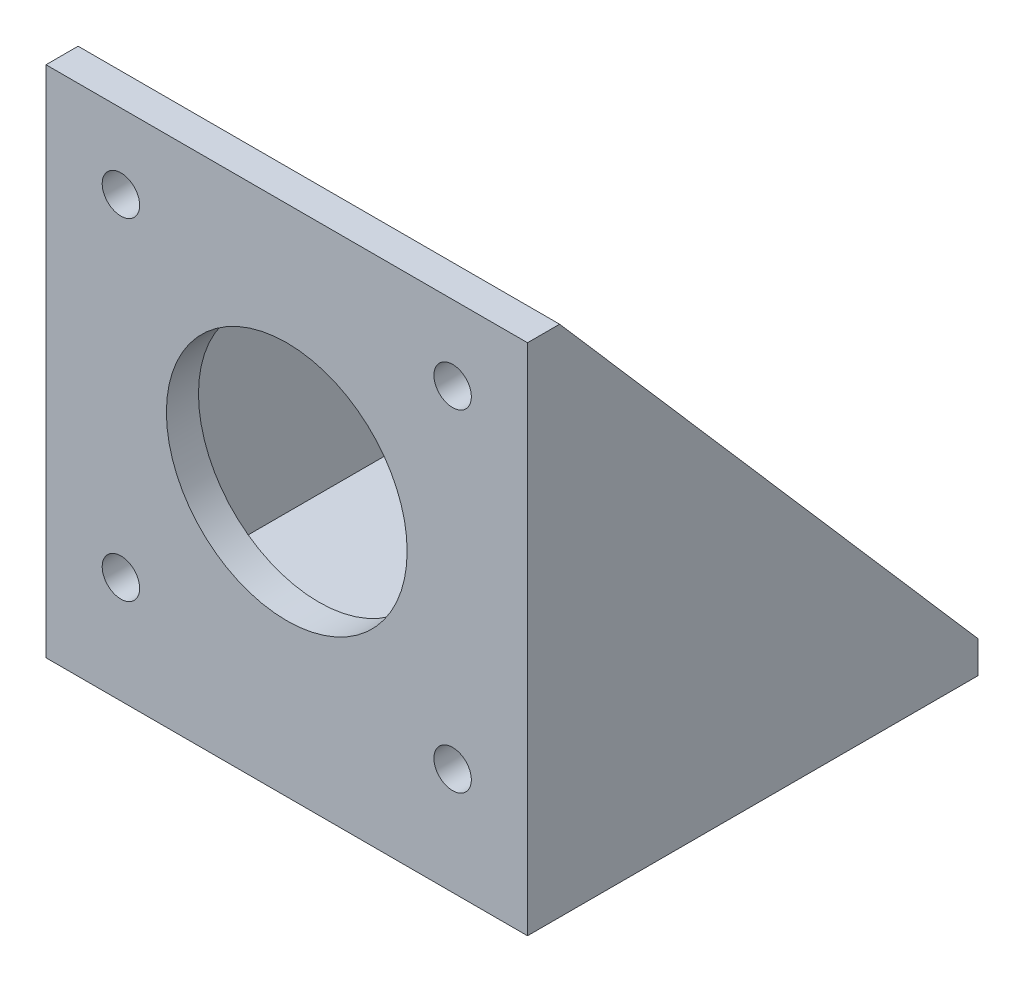
ISO-10303-21;
HEADER;
FILE_DESCRIPTION(('STEP AP214'),'2;1');
FILE_NAME('part.step','',(''),(''),'','','');
FILE_SCHEMA(('AUTOMOTIVE_DESIGN { 1 0 10303 214 1 1 1 1 }'));
ENDSEC;
DATA;
#1=APPLICATION_CONTEXT('core data for automotive mechanical design processes');
#2=APPLICATION_PROTOCOL_DEFINITION('international standard','automotive_design',2000,#1);
#3=PRODUCT_CONTEXT('',#1,'mechanical');
#4=PRODUCT('Part','Part','',(#3));
#5=PRODUCT_RELATED_PRODUCT_CATEGORY('part','',(#4));
#6=PRODUCT_DEFINITION_FORMATION('','',#4);
#7=PRODUCT_DEFINITION_CONTEXT('part definition',#1,'design');
#8=PRODUCT_DEFINITION('design','',#6,#7);
#9=PRODUCT_DEFINITION_SHAPE('','',#8);
#10=(LENGTH_UNIT() NAMED_UNIT(*) SI_UNIT(.MILLI.,.METRE.));
#11=(NAMED_UNIT(*) PLANE_ANGLE_UNIT() SI_UNIT($,.RADIAN.));
#12=(NAMED_UNIT(*) SI_UNIT($,.STERADIAN.) SOLID_ANGLE_UNIT());
#13=UNCERTAINTY_MEASURE_WITH_UNIT(LENGTH_MEASURE(1.E-05),#10,'distance_accuracy_value','');
#14=(GEOMETRIC_REPRESENTATION_CONTEXT(3) GLOBAL_UNCERTAINTY_ASSIGNED_CONTEXT((#13)) GLOBAL_UNIT_ASSIGNED_CONTEXT((#10,
#11,#12)) REPRESENTATION_CONTEXT('',''));
#15=CARTESIAN_POINT('',(0.,0.,0.));
#16=DIRECTION('',(0.,0.,1.));
#17=DIRECTION('',(1.,0.,0.));
#18=AXIS2_PLACEMENT_3D('',#15,#16,#17);
#19=CARTESIAN_POINT('',(0.,3.,0.));
#20=DIRECTION('',(0.,-1.,0.));
#21=DIRECTION('',(0.,0.,-1.));
#22=AXIS2_PLACEMENT_3D('',#19,#20,#21);
#23=PLANE('',#22);
#24=CARTESIAN_POINT('',(12.5,3.,-10.));
#25=DIRECTION('',(0.,1.,0.));
#26=DIRECTION('',(0.,0.,1.));
#27=AXIS2_PLACEMENT_3D('',#24,#25,#26);
#28=CIRCLE('',#27,1.55);
#29=CARTESIAN_POINT('',(12.5,3.,-8.45));
#30=VERTEX_POINT('',#29);
#31=EDGE_CURVE('E227',#30,#30,#28,.T.);
#32=ORIENTED_EDGE('',*,*,#31,.F.);
#33=EDGE_LOOP('',(#32));
#34=FACE_BOUND('',#33,.T.);
#35=CARTESIAN_POINT('',(-12.5,3.,-10.));
#36=DIRECTION('',(0.,1.,0.));
#37=DIRECTION('',(0.,0.,1.));
#38=AXIS2_PLACEMENT_3D('',#35,#36,#37);
#39=CIRCLE('',#38,1.55);
#40=CARTESIAN_POINT('',(-12.5,3.,-8.45));
#41=VERTEX_POINT('',#40);
#42=EDGE_CURVE('E221',#41,#41,#39,.T.);
#43=ORIENTED_EDGE('',*,*,#42,.F.);
#44=EDGE_LOOP('',(#43));
#45=FACE_BOUND('',#44,.T.);
#46=CARTESIAN_POINT('',(-12.5,3.,10.));
#47=DIRECTION('',(0.,1.,0.));
#48=DIRECTION('',(0.,0.,1.));
#49=AXIS2_PLACEMENT_3D('',#46,#47,#48);
#50=CIRCLE('',#49,1.55);
#51=CARTESIAN_POINT('',(-12.5,3.,11.55));
#52=VERTEX_POINT('',#51);
#53=EDGE_CURVE('E215',#52,#52,#50,.T.);
#54=ORIENTED_EDGE('',*,*,#53,.F.);
#55=EDGE_LOOP('',(#54));
#56=FACE_BOUND('',#55,.T.);
#57=CARTESIAN_POINT('',(12.5,3.,10.));
#58=DIRECTION('',(0.,1.,0.));
#59=DIRECTION('',(0.,0.,1.));
#60=AXIS2_PLACEMENT_3D('',#57,#58,#59);
#61=CIRCLE('',#60,1.55);
#62=CARTESIAN_POINT('',(12.5,3.,11.55));
#63=VERTEX_POINT('',#62);
#64=EDGE_CURVE('E209',#63,#63,#61,.T.);
#65=ORIENTED_EDGE('',*,*,#64,.F.);
#66=EDGE_LOOP('',(#65));
#67=FACE_BOUND('',#66,.T.);
#68=DIRECTION('',(0.,0.,-1.));
#69=VECTOR('',#68,1.);
#70=CARTESIAN_POINT('',(-20.,3.,-21.05));
#71=LINE('',#70,#69);
#72=CARTESIAN_POINT('',(-20.,3.,18.05));
#73=VERTEX_POINT('',#72);
#74=CARTESIAN_POINT('',(-20.,3.,-21.05));
#75=VERTEX_POINT('',#74);
#76=EDGE_CURVE('E52',#73,#75,#71,.T.);
#77=ORIENTED_EDGE('',*,*,#76,.F.);
#78=DIRECTION('',(1.,0.,0.));
#79=VECTOR('',#78,1.);
#80=CARTESIAN_POINT('',(-22.5,3.,18.05));
#81=LINE('',#80,#79);
#82=CARTESIAN_POINT('',(20.,3.,18.05));
#83=VERTEX_POINT('',#82);
#84=EDGE_CURVE('E39',#73,#83,#81,.T.);
#85=ORIENTED_EDGE('',*,*,#84,.T.);
#86=DIRECTION('',(0.,0.,-1.));
#87=VECTOR('',#86,1.);
#88=CARTESIAN_POINT('',(20.,3.,-21.05));
#89=LINE('',#88,#87);
#90=CARTESIAN_POINT('',(20.,3.,-21.05));
#91=VERTEX_POINT('',#90);
#92=EDGE_CURVE('E238',#83,#91,#89,.T.);
#93=ORIENTED_EDGE('',*,*,#92,.T.);
#94=DIRECTION('',(-1.,0.,0.));
#95=VECTOR('',#94,1.);
#96=CARTESIAN_POINT('',(-22.5,3.,-21.05));
#97=LINE('',#96,#95);
#98=EDGE_CURVE('E146',#91,#75,#97,.T.);
#99=ORIENTED_EDGE('',*,*,#98,.T.);
#100=EDGE_LOOP('',(#77,#85,#93,#99));
#101=FACE_BOUND('',#100,.T.);
#102=ADVANCED_FACE('F35',(#34,#45,#56,#67,#101),#23,.F.);
#103=CARTESIAN_POINT('',(-22.5,48.,18.05));
#104=DIRECTION('',(0.,0.,-1.));
#105=DIRECTION('',(-1.,0.,0.));
#106=AXIS2_PLACEMENT_3D('',#103,#104,#105);
#107=PLANE('',#106);
#108=CARTESIAN_POINT('',(15.5,10.,18.05));
#109=DIRECTION('',(0.,0.,-1.));
#110=DIRECTION('',(-1.,0.,0.));
#111=AXIS2_PLACEMENT_3D('',#108,#109,#110);
#112=CIRCLE('',#111,1.75);
#113=CARTESIAN_POINT('',(13.75,10.,18.05));
#114=VERTEX_POINT('',#113);
#115=EDGE_CURVE('E203',#114,#114,#112,.T.);
#116=ORIENTED_EDGE('',*,*,#115,.F.);
#117=EDGE_LOOP('',(#116));
#118=FACE_BOUND('',#117,.T.);
#119=CARTESIAN_POINT('',(-15.5,10.,18.05));
#120=DIRECTION('',(0.,0.,-1.));
#121=DIRECTION('',(-1.,0.,0.));
#122=AXIS2_PLACEMENT_3D('',#119,#120,#121);
#123=CIRCLE('',#122,1.75);
#124=CARTESIAN_POINT('',(-17.25,10.,18.05));
#125=VERTEX_POINT('',#124);
#126=EDGE_CURVE('E197',#125,#125,#123,.T.);
#127=ORIENTED_EDGE('',*,*,#126,.F.);
#128=EDGE_LOOP('',(#127));
#129=FACE_BOUND('',#128,.T.);
#130=CARTESIAN_POINT('',(-15.5,41.,18.05));
#131=DIRECTION('',(0.,0.,-1.));
#132=DIRECTION('',(-1.,0.,0.));
#133=AXIS2_PLACEMENT_3D('',#130,#131,#132);
#134=CIRCLE('',#133,1.75);
#135=CARTESIAN_POINT('',(-17.25,41.,18.05));
#136=VERTEX_POINT('',#135);
#137=EDGE_CURVE('E191',#136,#136,#134,.T.);
#138=ORIENTED_EDGE('',*,*,#137,.F.);
#139=EDGE_LOOP('',(#138));
#140=FACE_BOUND('',#139,.T.);
#141=CARTESIAN_POINT('',(15.5,41.,18.05));
#142=DIRECTION('',(0.,0.,-1.));
#143=DIRECTION('',(-1.,0.,0.));
#144=AXIS2_PLACEMENT_3D('',#141,#142,#143);
#145=CIRCLE('',#144,1.75);
#146=CARTESIAN_POINT('',(13.75,41.,18.05));
#147=VERTEX_POINT('',#146);
#148=EDGE_CURVE('E185',#147,#147,#145,.T.);
#149=ORIENTED_EDGE('',*,*,#148,.F.);
#150=EDGE_LOOP('',(#149));
#151=FACE_BOUND('',#150,.T.);
#152=CARTESIAN_POINT('',(0.,25.5,18.05));
#153=DIRECTION('',(0.,0.,-1.));
#154=DIRECTION('',(-1.,0.,0.));
#155=AXIS2_PLACEMENT_3D('',#152,#153,#154);
#156=CIRCLE('',#155,11.25);
#157=CARTESIAN_POINT('',(-11.25,25.5,18.05));
#158=VERTEX_POINT('',#157);
#159=EDGE_CURVE('E178',#158,#158,#156,.T.);
#160=ORIENTED_EDGE('',*,*,#159,.F.);
#161=EDGE_LOOP('',(#160));
#162=FACE_BOUND('',#161,.T.);
#163=ORIENTED_EDGE('',*,*,#84,.F.);
#164=DIRECTION('',(0.,-1.,0.));
#165=VECTOR('',#164,1.);
#166=CARTESIAN_POINT('',(-20.,3.,18.05));
#167=LINE('',#166,#165);
#168=CARTESIAN_POINT('',(-20.,48.,18.05));
#169=VERTEX_POINT('',#168);
#170=EDGE_CURVE('E117',#169,#73,#167,.T.);
#171=ORIENTED_EDGE('',*,*,#170,.F.);
#172=DIRECTION('',(1.,0.,0.));
#173=VECTOR('',#172,1.);
#174=CARTESIAN_POINT('',(-22.5,48.,18.05));
#175=LINE('',#174,#173);
#176=CARTESIAN_POINT('',(20.,48.,18.05));
#177=VERTEX_POINT('',#176);
#178=EDGE_CURVE('E102',#169,#177,#175,.T.);
#179=ORIENTED_EDGE('',*,*,#178,.T.);
#180=DIRECTION('',(0.,-1.,0.));
#181=VECTOR('',#180,1.);
#182=CARTESIAN_POINT('',(20.,3.,18.05));
#183=LINE('',#182,#181);
#184=EDGE_CURVE('E235',#177,#83,#183,.T.);
#185=ORIENTED_EDGE('',*,*,#184,.T.);
#186=EDGE_LOOP('',(#163,#171,#179,#185));
#187=FACE_BOUND('',#186,.T.);
#188=ADVANCED_FACE('F119',(#118,#129,#140,#151,#162,#187),#107,.T.);
#189=CARTESIAN_POINT('',(22.5,3.,21.05));
#190=DIRECTION('',(-1.,0.,0.));
#191=DIRECTION('',(0.,0.,1.));
#192=AXIS2_PLACEMENT_3D('',#189,#190,#191);
#193=PLANE('',#192);
#194=DIRECTION('',(0.,-1.,0.));
#195=VECTOR('',#194,1.);
#196=CARTESIAN_POINT('',(22.5,3.,-21.05));
#197=LINE('',#196,#195);
#198=CARTESIAN_POINT('',(22.5,3.,-21.05));
#199=VERTEX_POINT('',#198);
#200=CARTESIAN_POINT('',(22.5,0.,-21.05));
#201=VERTEX_POINT('',#200);
#202=EDGE_CURVE('E11',#199,#201,#197,.T.);
#203=ORIENTED_EDGE('',*,*,#202,.F.);
#204=DIRECTION('',(0.,0.75485825926705,0.655887954163148));
#205=VECTOR('',#204,1.);
#206=CARTESIAN_POINT('',(22.5,48.,18.05));
#207=LINE('',#206,#205);
#208=CARTESIAN_POINT('',(22.5,48.,18.05));
#209=VERTEX_POINT('',#208);
#210=EDGE_CURVE('E175',#199,#209,#207,.T.);
#211=ORIENTED_EDGE('',*,*,#210,.T.);
#212=DIRECTION('',(0.,0.,1.));
#213=VECTOR('',#212,1.);
#214=CARTESIAN_POINT('',(22.5,48.,21.05));
#215=LINE('',#214,#213);
#216=CARTESIAN_POINT('',(22.5,48.,21.05));
#217=VERTEX_POINT('',#216);
#218=EDGE_CURVE('E131',#209,#217,#215,.T.);
#219=ORIENTED_EDGE('',*,*,#218,.T.);
#220=DIRECTION('',(0.,-1.,0.));
#221=VECTOR('',#220,1.);
#222=CARTESIAN_POINT('',(22.5,3.,21.05));
#223=LINE('',#222,#221);
#224=CARTESIAN_POINT('',(22.5,0.,21.05));
#225=VERTEX_POINT('',#224);
#226=EDGE_CURVE('E145',#217,#225,#223,.T.);
#227=ORIENTED_EDGE('',*,*,#226,.T.);
#228=DIRECTION('',(0.,0.,-1.));
#229=VECTOR('',#228,1.);
#230=CARTESIAN_POINT('',(22.5,0.,21.05));
#231=LINE('',#230,#229);
#232=EDGE_CURVE('E139',#225,#201,#231,.T.);
#233=ORIENTED_EDGE('',*,*,#232,.T.);
#234=EDGE_LOOP('',(#203,#211,#219,#227,#233));
#235=FACE_BOUND('',#234,.T.);
#236=ADVANCED_FACE('F37',(#235),#193,.F.);
#237=CARTESIAN_POINT('',(-22.5,3.,-21.05));
#238=DIRECTION('',(0.,0.,1.));
#239=DIRECTION('',(1.,0.,0.));
#240=AXIS2_PLACEMENT_3D('',#237,#238,#239);
#241=PLANE('',#240);
#242=DIRECTION('',(-1.,0.,0.));
#243=VECTOR('',#242,1.);
#244=CARTESIAN_POINT('',(-22.5,0.,-21.05));
#245=LINE('',#244,#243);
#246=CARTESIAN_POINT('',(-22.5,0.,-21.05));
#247=VERTEX_POINT('',#246);
#248=EDGE_CURVE('E149',#201,#247,#245,.T.);
#249=ORIENTED_EDGE('',*,*,#248,.T.);
#250=DIRECTION('',(0.,-1.,0.));
#251=VECTOR('',#250,1.);
#252=CARTESIAN_POINT('',(-22.5,3.,-21.05));
#253=LINE('',#252,#251);
#254=CARTESIAN_POINT('',(-22.5,3.,-21.05));
#255=VERTEX_POINT('',#254);
#256=EDGE_CURVE('E45',#255,#247,#253,.T.);
#257=ORIENTED_EDGE('',*,*,#256,.F.);
#258=DIRECTION('',(-1.,0.,0.));
#259=VECTOR('',#258,1.);
#260=CARTESIAN_POINT('',(-20.,3.,-21.05));
#261=LINE('',#260,#259);
#262=EDGE_CURVE('E60',#75,#255,#261,.T.);
#263=ORIENTED_EDGE('',*,*,#262,.F.);
#264=ORIENTED_EDGE('',*,*,#98,.F.);
#265=EDGE_CURVE('E142',#199,#91,#97,.T.);
#266=ORIENTED_EDGE('',*,*,#265,.F.);
#267=ORIENTED_EDGE('',*,*,#202,.T.);
#268=EDGE_LOOP('',(#249,#257,#263,#264,#266,#267));
#269=FACE_BOUND('',#268,.T.);
#270=ADVANCED_FACE('F247',(#269),#241,.F.);
#271=CARTESIAN_POINT('',(-22.5,3.,21.05));
#272=DIRECTION('',(1.,0.,0.));
#273=DIRECTION('',(0.,0.,-1.));
#274=AXIS2_PLACEMENT_3D('',#271,#272,#273);
#275=PLANE('',#274);
#276=DIRECTION('',(0.,0.,1.));
#277=VECTOR('',#276,1.);
#278=CARTESIAN_POINT('',(-22.5,0.,21.05));
#279=LINE('',#278,#277);
#280=CARTESIAN_POINT('',(-22.5,0.,21.05));
#281=VERTEX_POINT('',#280);
#282=EDGE_CURVE('E151',#247,#281,#279,.T.);
#283=ORIENTED_EDGE('',*,*,#282,.T.);
#284=DIRECTION('',(0.,-1.,0.));
#285=VECTOR('',#284,1.);
#286=CARTESIAN_POINT('',(-22.5,3.,21.05));
#287=LINE('',#286,#285);
#288=CARTESIAN_POINT('',(-22.5,48.,21.05));
#289=VERTEX_POINT('',#288);
#290=EDGE_CURVE('E157',#289,#281,#287,.T.);
#291=ORIENTED_EDGE('',*,*,#290,.F.);
#292=DIRECTION('',(0.,0.,-1.));
#293=VECTOR('',#292,1.);
#294=CARTESIAN_POINT('',(-22.5,48.,21.05));
#295=LINE('',#294,#293);
#296=CARTESIAN_POINT('',(-22.5,48.,18.05));
#297=VERTEX_POINT('',#296);
#298=EDGE_CURVE('E114',#289,#297,#295,.T.);
#299=ORIENTED_EDGE('',*,*,#298,.T.);
#300=DIRECTION('',(0.,0.75485825926705,0.655887954163148));
#301=VECTOR('',#300,1.);
#302=CARTESIAN_POINT('',(-22.5,48.,18.05));
#303=LINE('',#302,#301);
#304=EDGE_CURVE('E122',#255,#297,#303,.T.);
#305=ORIENTED_EDGE('',*,*,#304,.F.);
#306=ORIENTED_EDGE('',*,*,#256,.T.);
#307=EDGE_LOOP('',(#283,#291,#299,#305,#306));
#308=FACE_BOUND('',#307,.T.);
#309=ADVANCED_FACE('F163',(#308),#275,.F.);
#310=CARTESIAN_POINT('',(-22.5,3.,21.05));
#311=DIRECTION('',(0.,0.,-1.));
#312=DIRECTION('',(-1.,0.,0.));
#313=AXIS2_PLACEMENT_3D('',#310,#311,#312);
#314=PLANE('',#313);
#315=CARTESIAN_POINT('',(15.5,10.,21.05));
#316=DIRECTION('',(0.,0.,-1.));
#317=DIRECTION('',(-1.,0.,0.));
#318=AXIS2_PLACEMENT_3D('',#315,#316,#317);
#319=CIRCLE('',#318,1.75);
#320=CARTESIAN_POINT('',(13.75,10.,21.05));
#321=VERTEX_POINT('',#320);
#322=EDGE_CURVE('E200',#321,#321,#319,.T.);
#323=ORIENTED_EDGE('',*,*,#322,.T.);
#324=EDGE_LOOP('',(#323));
#325=FACE_BOUND('',#324,.T.);
#326=CARTESIAN_POINT('',(-15.5,10.,21.05));
#327=DIRECTION('',(0.,0.,-1.));
#328=DIRECTION('',(-1.,0.,0.));
#329=AXIS2_PLACEMENT_3D('',#326,#327,#328);
#330=CIRCLE('',#329,1.75);
#331=CARTESIAN_POINT('',(-17.25,10.,21.05));
#332=VERTEX_POINT('',#331);
#333=EDGE_CURVE('E194',#332,#332,#330,.T.);
#334=ORIENTED_EDGE('',*,*,#333,.T.);
#335=EDGE_LOOP('',(#334));
#336=FACE_BOUND('',#335,.T.);
#337=CARTESIAN_POINT('',(-15.5,41.,21.05));
#338=DIRECTION('',(0.,0.,-1.));
#339=DIRECTION('',(-1.,0.,0.));
#340=AXIS2_PLACEMENT_3D('',#337,#338,#339);
#341=CIRCLE('',#340,1.75);
#342=CARTESIAN_POINT('',(-17.25,41.,21.05));
#343=VERTEX_POINT('',#342);
#344=EDGE_CURVE('E188',#343,#343,#341,.T.);
#345=ORIENTED_EDGE('',*,*,#344,.T.);
#346=EDGE_LOOP('',(#345));
#347=FACE_BOUND('',#346,.T.);
#348=CARTESIAN_POINT('',(15.5,41.,21.05));
#349=DIRECTION('',(0.,0.,-1.));
#350=DIRECTION('',(-1.,0.,0.));
#351=AXIS2_PLACEMENT_3D('',#348,#349,#350);
#352=CIRCLE('',#351,1.75);
#353=CARTESIAN_POINT('',(13.75,41.,21.05));
#354=VERTEX_POINT('',#353);
#355=EDGE_CURVE('E183',#354,#354,#352,.T.);
#356=ORIENTED_EDGE('',*,*,#355,.T.);
#357=EDGE_LOOP('',(#356));
#358=FACE_BOUND('',#357,.T.);
#359=CARTESIAN_POINT('',(0.,25.5,21.05));
#360=DIRECTION('',(0.,0.,-1.));
#361=DIRECTION('',(-1.,0.,0.));
#362=AXIS2_PLACEMENT_3D('',#359,#360,#361);
#363=CIRCLE('',#362,11.25);
#364=CARTESIAN_POINT('',(-11.25,25.5,21.05));
#365=VERTEX_POINT('',#364);
#366=EDGE_CURVE('E176',#365,#365,#363,.T.);
#367=ORIENTED_EDGE('',*,*,#366,.T.);
#368=EDGE_LOOP('',(#367));
#369=FACE_BOUND('',#368,.T.);
#370=DIRECTION('',(1.,0.,0.));
#371=VECTOR('',#370,1.);
#372=CARTESIAN_POINT('',(-22.5,0.,21.05));
#373=LINE('',#372,#371);
#374=EDGE_CURVE('E153',#281,#225,#373,.T.);
#375=ORIENTED_EDGE('',*,*,#374,.T.);
#376=ORIENTED_EDGE('',*,*,#226,.F.);
#377=DIRECTION('',(-1.,0.,0.));
#378=VECTOR('',#377,1.);
#379=CARTESIAN_POINT('',(-22.5,48.,21.05));
#380=LINE('',#379,#378);
#381=EDGE_CURVE('E133',#217,#289,#380,.T.);
#382=ORIENTED_EDGE('',*,*,#381,.T.);
#383=ORIENTED_EDGE('',*,*,#290,.T.);
#384=EDGE_LOOP('',(#375,#376,#382,#383));
#385=FACE_BOUND('',#384,.T.);
#386=ADVANCED_FACE('F169',(#325,#336,#347,#358,#369,#385),#314,.F.);
#387=CARTESIAN_POINT('',(0.,0.,0.));
#388=DIRECTION('',(0.,-1.,0.));
#389=DIRECTION('',(0.,0.,-1.));
#390=AXIS2_PLACEMENT_3D('',#387,#388,#389);
#391=PLANE('',#390);
#392=CARTESIAN_POINT('',(12.5,0.,-10.));
#393=DIRECTION('',(0.,1.,0.));
#394=DIRECTION('',(0.,0.,1.));
#395=AXIS2_PLACEMENT_3D('',#392,#393,#394);
#396=CIRCLE('',#395,1.55);
#397=CARTESIAN_POINT('',(12.5,0.,-8.45));
#398=VERTEX_POINT('',#397);
#399=EDGE_CURVE('E224',#398,#398,#396,.T.);
#400=ORIENTED_EDGE('',*,*,#399,.T.);
#401=EDGE_LOOP('',(#400));
#402=FACE_BOUND('',#401,.T.);
#403=CARTESIAN_POINT('',(-12.5,0.,-10.));
#404=DIRECTION('',(0.,1.,0.));
#405=DIRECTION('',(0.,0.,1.));
#406=AXIS2_PLACEMENT_3D('',#403,#404,#405);
#407=CIRCLE('',#406,1.55);
#408=CARTESIAN_POINT('',(-12.5,0.,-8.45));
#409=VERTEX_POINT('',#408);
#410=EDGE_CURVE('E218',#409,#409,#407,.T.);
#411=ORIENTED_EDGE('',*,*,#410,.T.);
#412=EDGE_LOOP('',(#411));
#413=FACE_BOUND('',#412,.T.);
#414=CARTESIAN_POINT('',(-12.5,0.,10.));
#415=DIRECTION('',(0.,1.,0.));
#416=DIRECTION('',(0.,0.,1.));
#417=AXIS2_PLACEMENT_3D('',#414,#415,#416);
#418=CIRCLE('',#417,1.55);
#419=CARTESIAN_POINT('',(-12.5,0.,11.55));
#420=VERTEX_POINT('',#419);
#421=EDGE_CURVE('E212',#420,#420,#418,.T.);
#422=ORIENTED_EDGE('',*,*,#421,.T.);
#423=EDGE_LOOP('',(#422));
#424=FACE_BOUND('',#423,.T.);
#425=CARTESIAN_POINT('',(12.5,0.,10.));
#426=DIRECTION('',(0.,1.,0.));
#427=DIRECTION('',(0.,0.,1.));
#428=AXIS2_PLACEMENT_3D('',#425,#426,#427);
#429=CIRCLE('',#428,1.55);
#430=CARTESIAN_POINT('',(12.5,0.,11.55));
#431=VERTEX_POINT('',#430);
#432=EDGE_CURVE('E206',#431,#431,#429,.T.);
#433=ORIENTED_EDGE('',*,*,#432,.T.);
#434=EDGE_LOOP('',(#433));
#435=FACE_BOUND('',#434,.T.);
#436=ORIENTED_EDGE('',*,*,#232,.F.);
#437=ORIENTED_EDGE('',*,*,#374,.F.);
#438=ORIENTED_EDGE('',*,*,#282,.F.);
#439=ORIENTED_EDGE('',*,*,#248,.F.);
#440=EDGE_LOOP('',(#436,#437,#438,#439));
#441=FACE_BOUND('',#440,.T.);
#442=ADVANCED_FACE('F167',(#402,#413,#424,#435,#441),#391,.T.);
#443=CARTESIAN_POINT('',(0.,48.,0.));
#444=DIRECTION('',(0.,-1.,0.));
#445=DIRECTION('',(0.,0.,-1.));
#446=AXIS2_PLACEMENT_3D('',#443,#444,#445);
#447=PLANE('',#446);
#448=ORIENTED_EDGE('',*,*,#298,.F.);
#449=ORIENTED_EDGE('',*,*,#381,.F.);
#450=ORIENTED_EDGE('',*,*,#218,.F.);
#451=DIRECTION('',(1.,0.,0.));
#452=VECTOR('',#451,1.);
#453=CARTESIAN_POINT('',(20.,48.,18.05));
#454=LINE('',#453,#452);
#455=EDGE_CURVE('E110',#177,#209,#454,.T.);
#456=ORIENTED_EDGE('',*,*,#455,.F.);
#457=ORIENTED_EDGE('',*,*,#178,.F.);
#458=EDGE_CURVE('E107',#297,#169,#175,.T.);
#459=ORIENTED_EDGE('',*,*,#458,.F.);
#460=EDGE_LOOP('',(#448,#449,#450,#456,#457,#459));
#461=FACE_BOUND('',#460,.T.);
#462=ADVANCED_FACE('F105',(#461),#447,.F.);
#463=CARTESIAN_POINT('',(0.,25.5,21.05));
#464=DIRECTION('',(0.,0.,-1.));
#465=DIRECTION('',(-1.,0.,0.));
#466=AXIS2_PLACEMENT_3D('',#463,#464,#465);
#467=CYLINDRICAL_SURFACE('',#466,11.25);
#468=ORIENTED_EDGE('',*,*,#366,.F.);
#469=EDGE_LOOP('',(#468));
#470=FACE_BOUND('',#469,.T.);
#471=ORIENTED_EDGE('',*,*,#159,.T.);
#472=EDGE_LOOP('',(#471));
#473=FACE_BOUND('',#472,.T.);
#474=ADVANCED_FACE('F318',(#470,#473),#467,.F.);
#475=CARTESIAN_POINT('',(15.5,41.,21.05));
#476=DIRECTION('',(0.,0.,-1.));
#477=DIRECTION('',(-1.,0.,0.));
#478=AXIS2_PLACEMENT_3D('',#475,#476,#477);
#479=CYLINDRICAL_SURFACE('',#478,1.75);
#480=ORIENTED_EDGE('',*,*,#355,.F.);
#481=EDGE_LOOP('',(#480));
#482=FACE_BOUND('',#481,.T.);
#483=ORIENTED_EDGE('',*,*,#148,.T.);
#484=EDGE_LOOP('',(#483));
#485=FACE_BOUND('',#484,.T.);
#486=ADVANCED_FACE('F409',(#482,#485),#479,.F.);
#487=CARTESIAN_POINT('',(-15.5,41.,21.05));
#488=DIRECTION('',(0.,0.,-1.));
#489=DIRECTION('',(-1.,0.,0.));
#490=AXIS2_PLACEMENT_3D('',#487,#488,#489);
#491=CYLINDRICAL_SURFACE('',#490,1.75);
#492=ORIENTED_EDGE('',*,*,#344,.F.);
#493=EDGE_LOOP('',(#492));
#494=FACE_BOUND('',#493,.T.);
#495=ORIENTED_EDGE('',*,*,#137,.T.);
#496=EDGE_LOOP('',(#495));
#497=FACE_BOUND('',#496,.T.);
#498=ADVANCED_FACE('F400',(#494,#497),#491,.F.);
#499=CARTESIAN_POINT('',(-15.5,10.,21.05));
#500=DIRECTION('',(0.,0.,-1.));
#501=DIRECTION('',(-1.,0.,0.));
#502=AXIS2_PLACEMENT_3D('',#499,#500,#501);
#503=CYLINDRICAL_SURFACE('',#502,1.75);
#504=ORIENTED_EDGE('',*,*,#333,.F.);
#505=EDGE_LOOP('',(#504));
#506=FACE_BOUND('',#505,.T.);
#507=ORIENTED_EDGE('',*,*,#126,.T.);
#508=EDGE_LOOP('',(#507));
#509=FACE_BOUND('',#508,.T.);
#510=ADVANCED_FACE('F391',(#506,#509),#503,.F.);
#511=CARTESIAN_POINT('',(15.5,10.,21.05));
#512=DIRECTION('',(0.,0.,-1.));
#513=DIRECTION('',(-1.,0.,0.));
#514=AXIS2_PLACEMENT_3D('',#511,#512,#513);
#515=CYLINDRICAL_SURFACE('',#514,1.75);
#516=ORIENTED_EDGE('',*,*,#322,.F.);
#517=EDGE_LOOP('',(#516));
#518=FACE_BOUND('',#517,.T.);
#519=ORIENTED_EDGE('',*,*,#115,.T.);
#520=EDGE_LOOP('',(#519));
#521=FACE_BOUND('',#520,.T.);
#522=ADVANCED_FACE('F381',(#518,#521),#515,.F.);
#523=CARTESIAN_POINT('',(12.5,0.,10.));
#524=DIRECTION('',(0.,1.,0.));
#525=DIRECTION('',(0.,0.,1.));
#526=AXIS2_PLACEMENT_3D('',#523,#524,#525);
#527=CYLINDRICAL_SURFACE('',#526,1.55);
#528=ORIENTED_EDGE('',*,*,#432,.F.);
#529=EDGE_LOOP('',(#528));
#530=FACE_BOUND('',#529,.T.);
#531=ORIENTED_EDGE('',*,*,#64,.T.);
#532=EDGE_LOOP('',(#531));
#533=FACE_BOUND('',#532,.T.);
#534=ADVANCED_FACE('F372',(#530,#533),#527,.F.);
#535=CARTESIAN_POINT('',(-12.5,0.,10.));
#536=DIRECTION('',(0.,1.,0.));
#537=DIRECTION('',(0.,0.,1.));
#538=AXIS2_PLACEMENT_3D('',#535,#536,#537);
#539=CYLINDRICAL_SURFACE('',#538,1.55);
#540=ORIENTED_EDGE('',*,*,#421,.F.);
#541=EDGE_LOOP('',(#540));
#542=FACE_BOUND('',#541,.T.);
#543=ORIENTED_EDGE('',*,*,#53,.T.);
#544=EDGE_LOOP('',(#543));
#545=FACE_BOUND('',#544,.T.);
#546=ADVANCED_FACE('F363',(#542,#545),#539,.F.);
#547=CARTESIAN_POINT('',(-12.5,0.,-10.));
#548=DIRECTION('',(0.,1.,0.));
#549=DIRECTION('',(0.,0.,1.));
#550=AXIS2_PLACEMENT_3D('',#547,#548,#549);
#551=CYLINDRICAL_SURFACE('',#550,1.55);
#552=ORIENTED_EDGE('',*,*,#410,.F.);
#553=EDGE_LOOP('',(#552));
#554=FACE_BOUND('',#553,.T.);
#555=ORIENTED_EDGE('',*,*,#42,.T.);
#556=EDGE_LOOP('',(#555));
#557=FACE_BOUND('',#556,.T.);
#558=ADVANCED_FACE('F258',(#554,#557),#551,.F.);
#559=CARTESIAN_POINT('',(12.5,0.,-10.));
#560=DIRECTION('',(0.,1.,0.));
#561=DIRECTION('',(0.,0.,1.));
#562=AXIS2_PLACEMENT_3D('',#559,#560,#561);
#563=CYLINDRICAL_SURFACE('',#562,1.55);
#564=ORIENTED_EDGE('',*,*,#399,.F.);
#565=EDGE_LOOP('',(#564));
#566=FACE_BOUND('',#565,.T.);
#567=ORIENTED_EDGE('',*,*,#31,.T.);
#568=EDGE_LOOP('',(#567));
#569=FACE_BOUND('',#568,.T.);
#570=ADVANCED_FACE('F251',(#566,#569),#563,.F.);
#571=CARTESIAN_POINT('',(20.,48.,18.05));
#572=DIRECTION('',(0.,0.655887954163148,-0.75485825926705));
#573=DIRECTION('',(0.,0.75485825926705,0.655887954163148));
#574=AXIS2_PLACEMENT_3D('',#571,#572,#573);
#575=PLANE('',#574);
#576=ORIENTED_EDGE('',*,*,#210,.F.);
#577=ORIENTED_EDGE('',*,*,#265,.T.);
#578=DIRECTION('',(0.,0.75485825926705,0.655887954163148));
#579=VECTOR('',#578,1.);
#580=CARTESIAN_POINT('',(20.,48.,18.05));
#581=LINE('',#580,#579);
#582=EDGE_CURVE('E233',#91,#177,#581,.T.);
#583=ORIENTED_EDGE('',*,*,#582,.T.);
#584=ORIENTED_EDGE('',*,*,#455,.T.);
#585=EDGE_LOOP('',(#576,#577,#583,#584));
#586=FACE_BOUND('',#585,.T.);
#587=ADVANCED_FACE('F249',(#586),#575,.T.);
#588=CARTESIAN_POINT('',(20.,0.,0.));
#589=DIRECTION('',(1.,0.,0.));
#590=DIRECTION('',(0.,0.,-1.));
#591=AXIS2_PLACEMENT_3D('',#588,#589,#590);
#592=PLANE('',#591);
#593=ORIENTED_EDGE('',*,*,#184,.F.);
#594=ORIENTED_EDGE('',*,*,#582,.F.);
#595=ORIENTED_EDGE('',*,*,#92,.F.);
#596=EDGE_LOOP('',(#593,#594,#595));
#597=FACE_BOUND('',#596,.T.);
#598=ADVANCED_FACE('F246',(#597),#592,.F.);
#599=CARTESIAN_POINT('',(-20.,48.,18.05));
#600=DIRECTION('',(0.,-0.655887954163148,0.75485825926705));
#601=DIRECTION('',(0.,-0.75485825926705,-0.655887954163148));
#602=AXIS2_PLACEMENT_3D('',#599,#600,#601);
#603=PLANE('',#602);
#604=ORIENTED_EDGE('',*,*,#304,.T.);
#605=ORIENTED_EDGE('',*,*,#458,.T.);
#606=DIRECTION('',(0.,0.75485825926705,0.655887954163148));
#607=VECTOR('',#606,1.);
#608=CARTESIAN_POINT('',(-20.,48.,18.05));
#609=LINE('',#608,#607);
#610=EDGE_CURVE('E121',#75,#169,#609,.T.);
#611=ORIENTED_EDGE('',*,*,#610,.F.);
#612=ORIENTED_EDGE('',*,*,#262,.T.);
#613=EDGE_LOOP('',(#604,#605,#611,#612));
#614=FACE_BOUND('',#613,.T.);
#615=ADVANCED_FACE('F129',(#614),#603,.F.);
#616=CARTESIAN_POINT('',(-20.,0.,0.));
#617=DIRECTION('',(-1.,0.,0.));
#618=DIRECTION('',(0.,0.,-1.));
#619=AXIS2_PLACEMENT_3D('',#616,#617,#618);
#620=PLANE('',#619);
#621=ORIENTED_EDGE('',*,*,#170,.T.);
#622=ORIENTED_EDGE('',*,*,#76,.T.);
#623=ORIENTED_EDGE('',*,*,#610,.T.);
#624=EDGE_LOOP('',(#621,#622,#623));
#625=FACE_BOUND('',#624,.T.);
#626=ADVANCED_FACE('F125',(#625),#620,.F.);
#627=CLOSED_SHELL('',(#102,#188,#236,#270,#309,#386,#442,#462,#474,#486,#498,#510,#522,#534,
#546,#558,#570,#587,#598,#615,#626));
#628=MANIFOLD_SOLID_BREP('B2',#627);
#629=ADVANCED_BREP_SHAPE_REPRESENTATION('',(#18,#628),#14);
#630=SHAPE_DEFINITION_REPRESENTATION(#9,#629);
ENDSEC;
END-ISO-10303-21;
